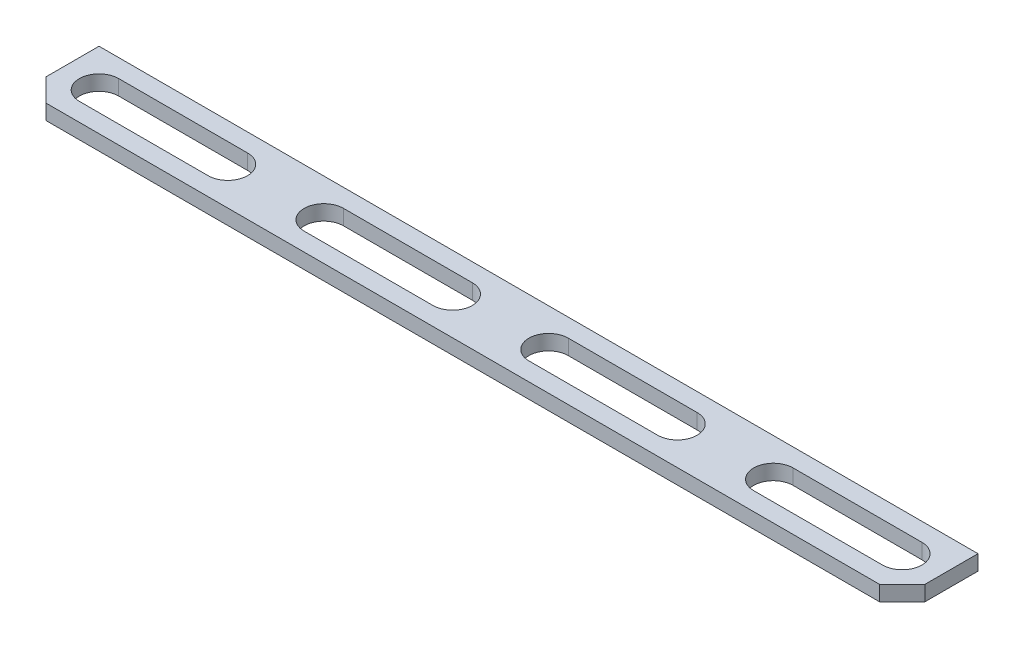
ISO-10303-21;
HEADER;
FILE_DESCRIPTION(('STEP AP214'),'2;1');
FILE_NAME('part.step','',(''),(''),'','','');
FILE_SCHEMA(('AUTOMOTIVE_DESIGN { 1 0 10303 214 1 1 1 1 }'));
ENDSEC;
DATA;
#1=APPLICATION_CONTEXT('core data for automotive mechanical design processes');
#2=APPLICATION_PROTOCOL_DEFINITION('international standard','automotive_design',2000,#1);
#3=PRODUCT_CONTEXT('',#1,'mechanical');
#4=PRODUCT('Part','Part','',(#3));
#5=PRODUCT_RELATED_PRODUCT_CATEGORY('part','',(#4));
#6=PRODUCT_DEFINITION_FORMATION('','',#4);
#7=PRODUCT_DEFINITION_CONTEXT('part definition',#1,'design');
#8=PRODUCT_DEFINITION('design','',#6,#7);
#9=PRODUCT_DEFINITION_SHAPE('','',#8);
#10=(LENGTH_UNIT() NAMED_UNIT(*) SI_UNIT(.MILLI.,.METRE.));
#11=(NAMED_UNIT(*) PLANE_ANGLE_UNIT() SI_UNIT($,.RADIAN.));
#12=(NAMED_UNIT(*) SI_UNIT($,.STERADIAN.) SOLID_ANGLE_UNIT());
#13=UNCERTAINTY_MEASURE_WITH_UNIT(LENGTH_MEASURE(1.E-05),#10,'distance_accuracy_value','');
#14=(GEOMETRIC_REPRESENTATION_CONTEXT(3) GLOBAL_UNCERTAINTY_ASSIGNED_CONTEXT((#13)) GLOBAL_UNIT_ASSIGNED_CONTEXT((#10,
#11,#12)) REPRESENTATION_CONTEXT('',''));
#15=CARTESIAN_POINT('',(0.,0.,0.));
#16=DIRECTION('',(0.,0.,1.));
#17=DIRECTION('',(1.,0.,0.));
#18=AXIS2_PLACEMENT_3D('',#15,#16,#17);
#19=CARTESIAN_POINT('',(0.,2.,0.));
#20=DIRECTION('',(1.,0.,0.));
#21=DIRECTION('',(0.,0.,-1.));
#22=AXIS2_PLACEMENT_3D('',#19,#20,#21);
#23=PLANE('',#22);
#24=DIRECTION('',(0.,0.,1.));
#25=VECTOR('',#24,1.);
#26=CARTESIAN_POINT('',(0.,0.,0.));
#27=LINE('',#26,#25);
#28=CARTESIAN_POINT('',(0.,0.,-10.));
#29=VERTEX_POINT('',#28);
#30=CARTESIAN_POINT('',(0.,0.,-3.00000000000002));
#31=VERTEX_POINT('',#30);
#32=EDGE_CURVE('E275',#29,#31,#27,.T.);
#33=ORIENTED_EDGE('',*,*,#32,.T.);
#34=DIRECTION('',(0.,1.,0.));
#35=VECTOR('',#34,1.);
#36=CARTESIAN_POINT('',(0.,2.,-3.00000000000002));
#37=LINE('',#36,#35);
#38=CARTESIAN_POINT('',(0.,2.,-3.00000000000002));
#39=VERTEX_POINT('',#38);
#40=EDGE_CURVE('E11',#31,#39,#37,.T.);
#41=ORIENTED_EDGE('',*,*,#40,.T.);
#42=DIRECTION('',(0.,0.,1.));
#43=VECTOR('',#42,1.);
#44=CARTESIAN_POINT('',(0.,2.,0.));
#45=LINE('',#44,#43);
#46=CARTESIAN_POINT('',(0.,2.,-10.));
#47=VERTEX_POINT('',#46);
#48=EDGE_CURVE('E282',#47,#39,#45,.T.);
#49=ORIENTED_EDGE('',*,*,#48,.F.);
#50=DIRECTION('',(0.,-1.,0.));
#51=VECTOR('',#50,1.);
#52=CARTESIAN_POINT('',(0.,2.,-10.));
#53=LINE('',#52,#51);
#54=EDGE_CURVE('E291',#47,#29,#53,.T.);
#55=ORIENTED_EDGE('',*,*,#54,.T.);
#56=EDGE_LOOP('',(#33,#41,#49,#55));
#57=FACE_BOUND('',#56,.T.);
#58=ADVANCED_FACE('F35',(#57),#23,.F.);
#59=CARTESIAN_POINT('',(0.,2.,0.));
#60=DIRECTION('',(0.,0.,-1.));
#61=DIRECTION('',(-1.,0.,0.));
#62=AXIS2_PLACEMENT_3D('',#59,#60,#61);
#63=PLANE('',#62);
#64=DIRECTION('',(1.,0.,0.));
#65=VECTOR('',#64,1.);
#66=CARTESIAN_POINT('',(0.,0.,0.));
#67=LINE('',#66,#65);
#68=CARTESIAN_POINT('',(3.,0.,0.));
#69=VERTEX_POINT('',#68);
#70=CARTESIAN_POINT('',(113.,0.,0.));
#71=VERTEX_POINT('',#70);
#72=EDGE_CURVE('E293',#69,#71,#67,.T.);
#73=ORIENTED_EDGE('',*,*,#72,.T.);
#74=DIRECTION('',(0.,1.,0.));
#75=VECTOR('',#74,1.);
#76=CARTESIAN_POINT('',(113.,2.,0.));
#77=LINE('',#76,#75);
#78=CARTESIAN_POINT('',(113.,2.,0.));
#79=VERTEX_POINT('',#78);
#80=EDGE_CURVE('E56',#71,#79,#77,.T.);
#81=ORIENTED_EDGE('',*,*,#80,.T.);
#82=DIRECTION('',(1.,0.,0.));
#83=VECTOR('',#82,1.);
#84=CARTESIAN_POINT('',(0.,2.,0.));
#85=LINE('',#84,#83);
#86=CARTESIAN_POINT('',(3.,2.,0.));
#87=VERTEX_POINT('',#86);
#88=EDGE_CURVE('E284',#87,#79,#85,.T.);
#89=ORIENTED_EDGE('',*,*,#88,.F.);
#90=DIRECTION('',(0.,-1.,0.));
#91=VECTOR('',#90,1.);
#92=CARTESIAN_POINT('',(3.,2.,0.));
#93=LINE('',#92,#91);
#94=EDGE_CURVE('E344',#87,#69,#93,.T.);
#95=ORIENTED_EDGE('',*,*,#94,.T.);
#96=EDGE_LOOP('',(#73,#81,#89,#95));
#97=FACE_BOUND('',#96,.T.);
#98=ADVANCED_FACE('F364',(#97),#63,.F.);
#99=CARTESIAN_POINT('',(116.,2.,0.));
#100=DIRECTION('',(-1.,0.,0.));
#101=DIRECTION('',(0.,0.,1.));
#102=AXIS2_PLACEMENT_3D('',#99,#100,#101);
#103=PLANE('',#102);
#104=DIRECTION('',(0.,0.,-1.));
#105=VECTOR('',#104,1.);
#106=CARTESIAN_POINT('',(116.,2.,0.));
#107=LINE('',#106,#105);
#108=CARTESIAN_POINT('',(116.,2.,-3.));
#109=VERTEX_POINT('',#108);
#110=CARTESIAN_POINT('',(116.,2.,-10.));
#111=VERTEX_POINT('',#110);
#112=EDGE_CURVE('E287',#109,#111,#107,.T.);
#113=ORIENTED_EDGE('',*,*,#112,.F.);
#114=DIRECTION('',(0.,-1.,0.));
#115=VECTOR('',#114,1.);
#116=CARTESIAN_POINT('',(116.,2.,-3.));
#117=LINE('',#116,#115);
#118=CARTESIAN_POINT('',(116.,0.,-3.));
#119=VERTEX_POINT('',#118);
#120=EDGE_CURVE('E337',#109,#119,#117,.T.);
#121=ORIENTED_EDGE('',*,*,#120,.T.);
#122=DIRECTION('',(0.,0.,-1.));
#123=VECTOR('',#122,1.);
#124=CARTESIAN_POINT('',(116.,0.,0.));
#125=LINE('',#124,#123);
#126=CARTESIAN_POINT('',(116.,0.,-10.));
#127=VERTEX_POINT('',#126);
#128=EDGE_CURVE('E295',#119,#127,#125,.T.);
#129=ORIENTED_EDGE('',*,*,#128,.T.);
#130=DIRECTION('',(0.,-1.,0.));
#131=VECTOR('',#130,1.);
#132=CARTESIAN_POINT('',(116.,2.,-10.));
#133=LINE('',#132,#131);
#134=EDGE_CURVE('E300',#111,#127,#133,.T.);
#135=ORIENTED_EDGE('',*,*,#134,.F.);
#136=EDGE_LOOP('',(#113,#121,#129,#135));
#137=FACE_BOUND('',#136,.T.);
#138=ADVANCED_FACE('F356',(#137),#103,.F.);
#139=CARTESIAN_POINT('',(0.,2.,-10.));
#140=DIRECTION('',(0.,0.,1.));
#141=DIRECTION('',(1.,0.,0.));
#142=AXIS2_PLACEMENT_3D('',#139,#140,#141);
#143=PLANE('',#142);
#144=DIRECTION('',(-1.,0.,0.));
#145=VECTOR('',#144,1.);
#146=CARTESIAN_POINT('',(0.,0.,-10.));
#147=LINE('',#146,#145);
#148=EDGE_CURVE('E285',#127,#29,#147,.T.);
#149=ORIENTED_EDGE('',*,*,#148,.T.);
#150=ORIENTED_EDGE('',*,*,#54,.F.);
#151=DIRECTION('',(-1.,0.,0.));
#152=VECTOR('',#151,1.);
#153=CARTESIAN_POINT('',(0.,2.,-10.));
#154=LINE('',#153,#152);
#155=EDGE_CURVE('E289',#111,#47,#154,.T.);
#156=ORIENTED_EDGE('',*,*,#155,.F.);
#157=ORIENTED_EDGE('',*,*,#134,.T.);
#158=EDGE_LOOP('',(#149,#150,#156,#157));
#159=FACE_BOUND('',#158,.T.);
#160=ADVANCED_FACE('F371',(#159),#143,.F.);
#161=CARTESIAN_POINT('',(0.,2.,0.));
#162=DIRECTION('',(0.,-1.,0.));
#163=DIRECTION('',(0.,0.,-1.));
#164=AXIS2_PLACEMENT_3D('',#161,#162,#163);
#165=PLANE('',#164);
#166=DIRECTION('',(1.,0.,0.));
#167=VECTOR('',#166,1.);
#168=CARTESIAN_POINT('',(94.,2.,-2.4));
#169=LINE('',#168,#167);
#170=CARTESIAN_POINT('',(94.,2.,-2.4));
#171=VERTEX_POINT('',#170);
#172=CARTESIAN_POINT('',(111.,2.,-2.4));
#173=VERTEX_POINT('',#172);
#174=EDGE_CURVE('E202',#171,#173,#169,.T.);
#175=ORIENTED_EDGE('',*,*,#174,.F.);
#176=CARTESIAN_POINT('',(94.,2.,-5.));
#177=DIRECTION('',(0.,1.,0.));
#178=DIRECTION('',(0.,0.,1.));
#179=AXIS2_PLACEMENT_3D('',#176,#177,#178);
#180=CIRCLE('',#179,2.6);
#181=CARTESIAN_POINT('',(94.,2.,-7.6));
#182=VERTEX_POINT('',#181);
#183=EDGE_CURVE('E207',#182,#171,#180,.T.);
#184=ORIENTED_EDGE('',*,*,#183,.F.);
#185=DIRECTION('',(-1.,0.,0.));
#186=VECTOR('',#185,1.);
#187=CARTESIAN_POINT('',(94.,2.,-7.6));
#188=LINE('',#187,#186);
#189=CARTESIAN_POINT('',(111.,2.,-7.6));
#190=VERTEX_POINT('',#189);
#191=EDGE_CURVE('E212',#190,#182,#188,.T.);
#192=ORIENTED_EDGE('',*,*,#191,.F.);
#193=CARTESIAN_POINT('',(111.,2.,-5.));
#194=DIRECTION('',(0.,1.,0.));
#195=DIRECTION('',(0.,0.,1.));
#196=AXIS2_PLACEMENT_3D('',#193,#194,#195);
#197=CIRCLE('',#196,2.6);
#198=EDGE_CURVE('E191',#173,#190,#197,.T.);
#199=ORIENTED_EDGE('',*,*,#198,.F.);
#200=EDGE_LOOP('',(#175,#184,#192,#199));
#201=FACE_BOUND('',#200,.T.);
#202=DIRECTION('',(1.,0.,0.));
#203=VECTOR('',#202,1.);
#204=CARTESIAN_POINT('',(64.3333333333333,2.,-2.4));
#205=LINE('',#204,#203);
#206=CARTESIAN_POINT('',(64.3333333333333,2.,-2.4));
#207=VERTEX_POINT('',#206);
#208=CARTESIAN_POINT('',(81.3333333333333,2.,-2.4));
#209=VERTEX_POINT('',#208);
#210=EDGE_CURVE('E223',#207,#209,#205,.T.);
#211=ORIENTED_EDGE('',*,*,#210,.F.);
#212=CARTESIAN_POINT('',(64.3333333333333,2.,-5.));
#213=DIRECTION('',(0.,1.,0.));
#214=DIRECTION('',(0.,0.,1.));
#215=AXIS2_PLACEMENT_3D('',#212,#213,#214);
#216=CIRCLE('',#215,2.6);
#217=CARTESIAN_POINT('',(64.3333333333333,2.,-7.6));
#218=VERTEX_POINT('',#217);
#219=EDGE_CURVE('E219',#218,#207,#216,.T.);
#220=ORIENTED_EDGE('',*,*,#219,.F.);
#221=DIRECTION('',(-1.,0.,0.));
#222=VECTOR('',#221,1.);
#223=CARTESIAN_POINT('',(64.3333333333333,2.,-7.6));
#224=LINE('',#223,#222);
#225=CARTESIAN_POINT('',(81.3333333333333,2.,-7.6));
#226=VERTEX_POINT('',#225);
#227=EDGE_CURVE('E229',#226,#218,#224,.T.);
#228=ORIENTED_EDGE('',*,*,#227,.F.);
#229=CARTESIAN_POINT('',(81.3333333333333,2.,-5.));
#230=DIRECTION('',(0.,1.,0.));
#231=DIRECTION('',(0.,0.,1.));
#232=AXIS2_PLACEMENT_3D('',#229,#230,#231);
#233=CIRCLE('',#232,2.6);
#234=EDGE_CURVE('E226',#209,#226,#233,.T.);
#235=ORIENTED_EDGE('',*,*,#234,.F.);
#236=EDGE_LOOP('',(#211,#220,#228,#235));
#237=FACE_BOUND('',#236,.T.);
#238=DIRECTION('',(1.,0.,0.));
#239=VECTOR('',#238,1.);
#240=CARTESIAN_POINT('',(34.6666666666667,2.,-2.4));
#241=LINE('',#240,#239);
#242=CARTESIAN_POINT('',(34.6666666666667,2.,-2.4));
#243=VERTEX_POINT('',#242);
#244=CARTESIAN_POINT('',(51.6666666666667,2.,-2.4));
#245=VERTEX_POINT('',#244);
#246=EDGE_CURVE('E243',#243,#245,#241,.T.);
#247=ORIENTED_EDGE('',*,*,#246,.F.);
#248=CARTESIAN_POINT('',(34.6666666666667,2.,-5.));
#249=DIRECTION('',(0.,1.,0.));
#250=DIRECTION('',(0.,0.,1.));
#251=AXIS2_PLACEMENT_3D('',#248,#249,#250);
#252=CIRCLE('',#251,2.6);
#253=CARTESIAN_POINT('',(34.6666666666667,2.,-7.6));
#254=VERTEX_POINT('',#253);
#255=EDGE_CURVE('E235',#254,#243,#252,.T.);
#256=ORIENTED_EDGE('',*,*,#255,.F.);
#257=DIRECTION('',(-1.,0.,0.));
#258=VECTOR('',#257,1.);
#259=CARTESIAN_POINT('',(34.6666666666667,2.,-7.6));
#260=LINE('',#259,#258);
#261=CARTESIAN_POINT('',(51.6666666666667,2.,-7.6));
#262=VERTEX_POINT('',#261);
#263=EDGE_CURVE('E249',#262,#254,#260,.T.);
#264=ORIENTED_EDGE('',*,*,#263,.F.);
#265=CARTESIAN_POINT('',(51.6666666666667,2.,-5.));
#266=DIRECTION('',(0.,1.,0.));
#267=DIRECTION('',(0.,0.,1.));
#268=AXIS2_PLACEMENT_3D('',#265,#266,#267);
#269=CIRCLE('',#268,2.6);
#270=EDGE_CURVE('E246',#245,#262,#269,.T.);
#271=ORIENTED_EDGE('',*,*,#270,.F.);
#272=EDGE_LOOP('',(#247,#256,#264,#271));
#273=FACE_BOUND('',#272,.T.);
#274=DIRECTION('',(1.,0.,0.));
#275=VECTOR('',#274,1.);
#276=CARTESIAN_POINT('',(5.,2.,-2.4));
#277=LINE('',#276,#275);
#278=CARTESIAN_POINT('',(5.,2.,-2.4));
#279=VERTEX_POINT('',#278);
#280=CARTESIAN_POINT('',(22.,2.,-2.4));
#281=VERTEX_POINT('',#280);
#282=EDGE_CURVE('E263',#279,#281,#277,.T.);
#283=ORIENTED_EDGE('',*,*,#282,.F.);
#284=CARTESIAN_POINT('',(5.,2.,-5.));
#285=DIRECTION('',(0.,1.,0.));
#286=DIRECTION('',(0.,0.,1.));
#287=AXIS2_PLACEMENT_3D('',#284,#285,#286);
#288=CIRCLE('',#287,2.6);
#289=CARTESIAN_POINT('',(5.,2.,-7.6));
#290=VERTEX_POINT('',#289);
#291=EDGE_CURVE('E255',#290,#279,#288,.T.);
#292=ORIENTED_EDGE('',*,*,#291,.F.);
#293=DIRECTION('',(-1.,0.,0.));
#294=VECTOR('',#293,1.);
#295=CARTESIAN_POINT('',(5.,2.,-7.6));
#296=LINE('',#295,#294);
#297=CARTESIAN_POINT('',(22.,2.,-7.6));
#298=VERTEX_POINT('',#297);
#299=EDGE_CURVE('E269',#298,#290,#296,.T.);
#300=ORIENTED_EDGE('',*,*,#299,.F.);
#301=CARTESIAN_POINT('',(22.,2.,-5.));
#302=DIRECTION('',(0.,1.,0.));
#303=DIRECTION('',(0.,0.,1.));
#304=AXIS2_PLACEMENT_3D('',#301,#302,#303);
#305=CIRCLE('',#304,2.6);
#306=EDGE_CURVE('E266',#281,#298,#305,.T.);
#307=ORIENTED_EDGE('',*,*,#306,.F.);
#308=EDGE_LOOP('',(#283,#292,#300,#307));
#309=FACE_BOUND('',#308,.T.);
#310=ORIENTED_EDGE('',*,*,#88,.T.);
#311=DIRECTION('',(-0.707106781186549,0.,0.707106781186546));
#312=VECTOR('',#311,1.);
#313=CARTESIAN_POINT('',(116.,2.,-3.));
#314=LINE('',#313,#312);
#315=EDGE_CURVE('E43',#79,#109,#314,.F.);
#316=ORIENTED_EDGE('',*,*,#315,.T.);
#317=ORIENTED_EDGE('',*,*,#112,.T.);
#318=ORIENTED_EDGE('',*,*,#155,.T.);
#319=ORIENTED_EDGE('',*,*,#48,.T.);
#320=DIRECTION('',(-0.707106781186546,0.,-0.707106781186549));
#321=VECTOR('',#320,1.);
#322=CARTESIAN_POINT('',(3.,2.,0.));
#323=LINE('',#322,#321);
#324=EDGE_CURVE('E348',#39,#87,#323,.F.);
#325=ORIENTED_EDGE('',*,*,#324,.T.);
#326=EDGE_LOOP('',(#310,#316,#317,#318,#319,#325));
#327=FACE_BOUND('',#326,.T.);
#328=ADVANCED_FACE('F209',(#201,#237,#273,#309,#327),#165,.F.);
#329=CARTESIAN_POINT('',(0.,0.,0.));
#330=DIRECTION('',(0.,-1.,0.));
#331=DIRECTION('',(0.,0.,-1.));
#332=AXIS2_PLACEMENT_3D('',#329,#330,#331);
#333=PLANE('',#332);
#334=CARTESIAN_POINT('',(94.,0.,-5.));
#335=DIRECTION('',(0.,-1.,0.));
#336=DIRECTION('',(0.,0.,-1.));
#337=AXIS2_PLACEMENT_3D('',#334,#335,#336);
#338=CIRCLE('',#337,2.6);
#339=CARTESIAN_POINT('',(94.,0.,-2.4));
#340=VERTEX_POINT('',#339);
#341=CARTESIAN_POINT('',(94.,0.,-7.6));
#342=VERTEX_POINT('',#341);
#343=EDGE_CURVE('E335',#340,#342,#338,.T.);
#344=ORIENTED_EDGE('',*,*,#343,.F.);
#345=DIRECTION('',(-1.,0.,0.));
#346=VECTOR('',#345,1.);
#347=CARTESIAN_POINT('',(0.,0.,-2.4));
#348=LINE('',#347,#346);
#349=CARTESIAN_POINT('',(111.,0.,-2.4));
#350=VERTEX_POINT('',#349);
#351=EDGE_CURVE('E330',#350,#340,#348,.T.);
#352=ORIENTED_EDGE('',*,*,#351,.F.);
#353=CARTESIAN_POINT('',(111.,0.,-5.));
#354=DIRECTION('',(0.,-1.,0.));
#355=DIRECTION('',(0.,0.,-1.));
#356=AXIS2_PLACEMENT_3D('',#353,#354,#355);
#357=CIRCLE('',#356,2.6);
#358=CARTESIAN_POINT('',(111.,0.,-7.6));
#359=VERTEX_POINT('',#358);
#360=EDGE_CURVE('E194',#359,#350,#357,.T.);
#361=ORIENTED_EDGE('',*,*,#360,.F.);
#362=DIRECTION('',(1.,0.,0.));
#363=VECTOR('',#362,1.);
#364=CARTESIAN_POINT('',(0.,0.,-7.6));
#365=LINE('',#364,#363);
#366=EDGE_CURVE('E333',#342,#359,#365,.T.);
#367=ORIENTED_EDGE('',*,*,#366,.F.);
#368=EDGE_LOOP('',(#344,#352,#361,#367));
#369=FACE_BOUND('',#368,.T.);
#370=CARTESIAN_POINT('',(64.3333333333333,0.,-5.));
#371=DIRECTION('',(0.,-1.,0.));
#372=DIRECTION('',(0.,0.,-1.));
#373=AXIS2_PLACEMENT_3D('',#370,#371,#372);
#374=CIRCLE('',#373,2.6);
#375=CARTESIAN_POINT('',(64.3333333333333,0.,-2.4));
#376=VERTEX_POINT('',#375);
#377=CARTESIAN_POINT('',(64.3333333333333,0.,-7.6));
#378=VERTEX_POINT('',#377);
#379=EDGE_CURVE('E328',#376,#378,#374,.T.);
#380=ORIENTED_EDGE('',*,*,#379,.F.);
#381=DIRECTION('',(-1.,0.,0.));
#382=VECTOR('',#381,1.);
#383=CARTESIAN_POINT('',(0.,0.,-2.4));
#384=LINE('',#383,#382);
#385=CARTESIAN_POINT('',(81.3333333333333,0.,-2.4));
#386=VERTEX_POINT('',#385);
#387=EDGE_CURVE('E321',#386,#376,#384,.T.);
#388=ORIENTED_EDGE('',*,*,#387,.F.);
#389=CARTESIAN_POINT('',(81.3333333333333,0.,-5.));
#390=DIRECTION('',(0.,-1.,0.));
#391=DIRECTION('',(0.,0.,-1.));
#392=AXIS2_PLACEMENT_3D('',#389,#390,#391);
#393=CIRCLE('',#392,2.6);
#394=CARTESIAN_POINT('',(81.3333333333333,0.,-7.6));
#395=VERTEX_POINT('',#394);
#396=EDGE_CURVE('E323',#395,#386,#393,.T.);
#397=ORIENTED_EDGE('',*,*,#396,.F.);
#398=DIRECTION('',(1.,0.,0.));
#399=VECTOR('',#398,1.);
#400=CARTESIAN_POINT('',(0.,0.,-7.6));
#401=LINE('',#400,#399);
#402=EDGE_CURVE('E326',#378,#395,#401,.T.);
#403=ORIENTED_EDGE('',*,*,#402,.F.);
#404=EDGE_LOOP('',(#380,#388,#397,#403));
#405=FACE_BOUND('',#404,.T.);
#406=CARTESIAN_POINT('',(34.6666666666667,0.,-5.));
#407=DIRECTION('',(0.,-1.,0.));
#408=DIRECTION('',(0.,0.,-1.));
#409=AXIS2_PLACEMENT_3D('',#406,#407,#408);
#410=CIRCLE('',#409,2.6);
#411=CARTESIAN_POINT('',(34.6666666666667,0.,-2.4));
#412=VERTEX_POINT('',#411);
#413=CARTESIAN_POINT('',(34.6666666666667,0.,-7.6));
#414=VERTEX_POINT('',#413);
#415=EDGE_CURVE('E319',#412,#414,#410,.T.);
#416=ORIENTED_EDGE('',*,*,#415,.F.);
#417=DIRECTION('',(-1.,0.,0.));
#418=VECTOR('',#417,1.);
#419=CARTESIAN_POINT('',(0.,0.,-2.4));
#420=LINE('',#419,#418);
#421=CARTESIAN_POINT('',(51.6666666666667,0.,-2.4));
#422=VERTEX_POINT('',#421);
#423=EDGE_CURVE('E312',#422,#412,#420,.T.);
#424=ORIENTED_EDGE('',*,*,#423,.F.);
#425=CARTESIAN_POINT('',(51.6666666666667,0.,-5.));
#426=DIRECTION('',(0.,-1.,0.));
#427=DIRECTION('',(0.,0.,-1.));
#428=AXIS2_PLACEMENT_3D('',#425,#426,#427);
#429=CIRCLE('',#428,2.6);
#430=CARTESIAN_POINT('',(51.6666666666667,0.,-7.6));
#431=VERTEX_POINT('',#430);
#432=EDGE_CURVE('E314',#431,#422,#429,.T.);
#433=ORIENTED_EDGE('',*,*,#432,.F.);
#434=DIRECTION('',(1.,0.,0.));
#435=VECTOR('',#434,1.);
#436=CARTESIAN_POINT('',(0.,0.,-7.6));
#437=LINE('',#436,#435);
#438=EDGE_CURVE('E317',#414,#431,#437,.T.);
#439=ORIENTED_EDGE('',*,*,#438,.F.);
#440=EDGE_LOOP('',(#416,#424,#433,#439));
#441=FACE_BOUND('',#440,.T.);
#442=CARTESIAN_POINT('',(5.,0.,-5.));
#443=DIRECTION('',(0.,-1.,0.));
#444=DIRECTION('',(0.,0.,-1.));
#445=AXIS2_PLACEMENT_3D('',#442,#443,#444);
#446=CIRCLE('',#445,2.6);
#447=CARTESIAN_POINT('',(5.,0.,-2.4));
#448=VERTEX_POINT('',#447);
#449=CARTESIAN_POINT('',(5.,0.,-7.6));
#450=VERTEX_POINT('',#449);
#451=EDGE_CURVE('E310',#448,#450,#446,.T.);
#452=ORIENTED_EDGE('',*,*,#451,.F.);
#453=DIRECTION('',(-1.,0.,0.));
#454=VECTOR('',#453,1.);
#455=CARTESIAN_POINT('',(0.,0.,-2.4));
#456=LINE('',#455,#454);
#457=CARTESIAN_POINT('',(22.,0.,-2.4));
#458=VERTEX_POINT('',#457);
#459=EDGE_CURVE('E303',#458,#448,#456,.T.);
#460=ORIENTED_EDGE('',*,*,#459,.F.);
#461=CARTESIAN_POINT('',(22.,0.,-5.));
#462=DIRECTION('',(0.,-1.,0.));
#463=DIRECTION('',(0.,0.,-1.));
#464=AXIS2_PLACEMENT_3D('',#461,#462,#463);
#465=CIRCLE('',#464,2.6);
#466=CARTESIAN_POINT('',(22.,0.,-7.6));
#467=VERTEX_POINT('',#466);
#468=EDGE_CURVE('E305',#467,#458,#465,.T.);
#469=ORIENTED_EDGE('',*,*,#468,.F.);
#470=DIRECTION('',(1.,0.,0.));
#471=VECTOR('',#470,1.);
#472=CARTESIAN_POINT('',(0.,0.,-7.6));
#473=LINE('',#472,#471);
#474=EDGE_CURVE('E308',#450,#467,#473,.T.);
#475=ORIENTED_EDGE('',*,*,#474,.F.);
#476=EDGE_LOOP('',(#452,#460,#469,#475));
#477=FACE_BOUND('',#476,.T.);
#478=ORIENTED_EDGE('',*,*,#128,.F.);
#479=DIRECTION('',(0.707106781186549,0.,-0.707106781186546));
#480=VECTOR('',#479,1.);
#481=CARTESIAN_POINT('',(56.4999999999997,0.,56.5));
#482=LINE('',#481,#480);
#483=EDGE_CURVE('E342',#119,#71,#482,.F.);
#484=ORIENTED_EDGE('',*,*,#483,.T.);
#485=ORIENTED_EDGE('',*,*,#72,.F.);
#486=DIRECTION('',(0.707106781186546,0.,0.707106781186549));
#487=VECTOR('',#486,1.);
#488=CARTESIAN_POINT('',(1.50000000000001,0.,-1.5));
#489=LINE('',#488,#487);
#490=EDGE_CURVE('E340',#69,#31,#489,.F.);
#491=ORIENTED_EDGE('',*,*,#490,.T.);
#492=ORIENTED_EDGE('',*,*,#32,.F.);
#493=ORIENTED_EDGE('',*,*,#148,.F.);
#494=EDGE_LOOP('',(#478,#484,#485,#491,#492,#493));
#495=FACE_BOUND('',#494,.T.);
#496=ADVANCED_FACE('F362',(#369,#405,#441,#477,#495),#333,.T.);
#497=CARTESIAN_POINT('',(5.,-8.,-5.));
#498=DIRECTION('',(0.,1.,0.));
#499=DIRECTION('',(0.,0.,1.));
#500=AXIS2_PLACEMENT_3D('',#497,#498,#499);
#501=CYLINDRICAL_SURFACE('',#500,2.6);
#502=ORIENTED_EDGE('',*,*,#451,.T.);
#503=DIRECTION('',(0.,1.,0.));
#504=VECTOR('',#503,1.);
#505=CARTESIAN_POINT('',(5.,-8.,-7.6));
#506=LINE('',#505,#504);
#507=EDGE_CURVE('E273',#450,#290,#506,.T.);
#508=ORIENTED_EDGE('',*,*,#507,.T.);
#509=ORIENTED_EDGE('',*,*,#291,.T.);
#510=DIRECTION('',(0.,1.,0.));
#511=VECTOR('',#510,1.);
#512=CARTESIAN_POINT('',(5.,-8.,-2.4));
#513=LINE('',#512,#511);
#514=EDGE_CURVE('E272',#448,#279,#513,.T.);
#515=ORIENTED_EDGE('',*,*,#514,.F.);
#516=EDGE_LOOP('',(#502,#508,#509,#515));
#517=FACE_BOUND('',#516,.T.);
#518=ADVANCED_FACE('F441',(#517),#501,.F.);
#519=CARTESIAN_POINT('',(5.,-8.,-7.6));
#520=DIRECTION('',(0.,0.,-1.));
#521=DIRECTION('',(-1.,0.,0.));
#522=AXIS2_PLACEMENT_3D('',#519,#520,#521);
#523=PLANE('',#522);
#524=ORIENTED_EDGE('',*,*,#474,.T.);
#525=DIRECTION('',(0.,1.,0.));
#526=VECTOR('',#525,1.);
#527=CARTESIAN_POINT('',(22.,-8.,-7.6));
#528=LINE('',#527,#526);
#529=EDGE_CURVE('E276',#467,#298,#528,.T.);
#530=ORIENTED_EDGE('',*,*,#529,.T.);
#531=ORIENTED_EDGE('',*,*,#299,.T.);
#532=ORIENTED_EDGE('',*,*,#507,.F.);
#533=EDGE_LOOP('',(#524,#530,#531,#532));
#534=FACE_BOUND('',#533,.T.);
#535=ADVANCED_FACE('F437',(#534),#523,.F.);
#536=CARTESIAN_POINT('',(22.,-8.,-5.));
#537=DIRECTION('',(0.,1.,0.));
#538=DIRECTION('',(0.,0.,1.));
#539=AXIS2_PLACEMENT_3D('',#536,#537,#538);
#540=CYLINDRICAL_SURFACE('',#539,2.6);
#541=ORIENTED_EDGE('',*,*,#468,.T.);
#542=DIRECTION('',(0.,1.,0.));
#543=VECTOR('',#542,1.);
#544=CARTESIAN_POINT('',(22.,-8.,-2.4));
#545=LINE('',#544,#543);
#546=EDGE_CURVE('E278',#458,#281,#545,.T.);
#547=ORIENTED_EDGE('',*,*,#546,.T.);
#548=ORIENTED_EDGE('',*,*,#306,.T.);
#549=ORIENTED_EDGE('',*,*,#529,.F.);
#550=EDGE_LOOP('',(#541,#547,#548,#549));
#551=FACE_BOUND('',#550,.T.);
#552=ADVANCED_FACE('F440',(#551),#540,.F.);
#553=CARTESIAN_POINT('',(5.,-8.,-2.4));
#554=DIRECTION('',(0.,0.,1.));
#555=DIRECTION('',(1.,0.,0.));
#556=AXIS2_PLACEMENT_3D('',#553,#554,#555);
#557=PLANE('',#556);
#558=ORIENTED_EDGE('',*,*,#459,.T.);
#559=ORIENTED_EDGE('',*,*,#514,.T.);
#560=ORIENTED_EDGE('',*,*,#282,.T.);
#561=ORIENTED_EDGE('',*,*,#546,.F.);
#562=EDGE_LOOP('',(#558,#559,#560,#561));
#563=FACE_BOUND('',#562,.T.);
#564=ADVANCED_FACE('F435',(#563),#557,.F.);
#565=CARTESIAN_POINT('',(34.6666666666667,-8.,-5.));
#566=DIRECTION('',(0.,1.,0.));
#567=DIRECTION('',(0.,0.,1.));
#568=AXIS2_PLACEMENT_3D('',#565,#566,#567);
#569=CYLINDRICAL_SURFACE('',#568,2.6);
#570=ORIENTED_EDGE('',*,*,#415,.T.);
#571=DIRECTION('',(0.,1.,0.));
#572=VECTOR('',#571,1.);
#573=CARTESIAN_POINT('',(34.6666666666667,-8.,-7.6));
#574=LINE('',#573,#572);
#575=EDGE_CURVE('E253',#414,#254,#574,.T.);
#576=ORIENTED_EDGE('',*,*,#575,.T.);
#577=ORIENTED_EDGE('',*,*,#255,.T.);
#578=DIRECTION('',(0.,1.,0.));
#579=VECTOR('',#578,1.);
#580=CARTESIAN_POINT('',(34.6666666666667,-8.,-2.4));
#581=LINE('',#580,#579);
#582=EDGE_CURVE('E252',#412,#243,#581,.T.);
#583=ORIENTED_EDGE('',*,*,#582,.F.);
#584=EDGE_LOOP('',(#570,#576,#577,#583));
#585=FACE_BOUND('',#584,.T.);
#586=ADVANCED_FACE('F425',(#585),#569,.F.);
#587=CARTESIAN_POINT('',(34.6666666666667,-8.,-7.6));
#588=DIRECTION('',(0.,0.,-1.));
#589=DIRECTION('',(-1.,0.,0.));
#590=AXIS2_PLACEMENT_3D('',#587,#588,#589);
#591=PLANE('',#590);
#592=ORIENTED_EDGE('',*,*,#438,.T.);
#593=DIRECTION('',(0.,1.,0.));
#594=VECTOR('',#593,1.);
#595=CARTESIAN_POINT('',(51.6666666666667,-8.,-7.6));
#596=LINE('',#595,#594);
#597=EDGE_CURVE('E256',#431,#262,#596,.T.);
#598=ORIENTED_EDGE('',*,*,#597,.T.);
#599=ORIENTED_EDGE('',*,*,#263,.T.);
#600=ORIENTED_EDGE('',*,*,#575,.F.);
#601=EDGE_LOOP('',(#592,#598,#599,#600));
#602=FACE_BOUND('',#601,.T.);
#603=ADVANCED_FACE('F421',(#602),#591,.F.);
#604=CARTESIAN_POINT('',(51.6666666666667,-8.,-5.));
#605=DIRECTION('',(0.,1.,0.));
#606=DIRECTION('',(0.,0.,1.));
#607=AXIS2_PLACEMENT_3D('',#604,#605,#606);
#608=CYLINDRICAL_SURFACE('',#607,2.6);
#609=ORIENTED_EDGE('',*,*,#432,.T.);
#610=DIRECTION('',(0.,1.,0.));
#611=VECTOR('',#610,1.);
#612=CARTESIAN_POINT('',(51.6666666666667,-8.,-2.4));
#613=LINE('',#612,#611);
#614=EDGE_CURVE('E258',#422,#245,#613,.T.);
#615=ORIENTED_EDGE('',*,*,#614,.T.);
#616=ORIENTED_EDGE('',*,*,#270,.T.);
#617=ORIENTED_EDGE('',*,*,#597,.F.);
#618=EDGE_LOOP('',(#609,#615,#616,#617));
#619=FACE_BOUND('',#618,.T.);
#620=ADVANCED_FACE('F424',(#619),#608,.F.);
#621=CARTESIAN_POINT('',(34.6666666666667,-8.,-2.4));
#622=DIRECTION('',(0.,0.,1.));
#623=DIRECTION('',(1.,0.,0.));
#624=AXIS2_PLACEMENT_3D('',#621,#622,#623);
#625=PLANE('',#624);
#626=ORIENTED_EDGE('',*,*,#423,.T.);
#627=ORIENTED_EDGE('',*,*,#582,.T.);
#628=ORIENTED_EDGE('',*,*,#246,.T.);
#629=ORIENTED_EDGE('',*,*,#614,.F.);
#630=EDGE_LOOP('',(#626,#627,#628,#629));
#631=FACE_BOUND('',#630,.T.);
#632=ADVANCED_FACE('F419',(#631),#625,.F.);
#633=CARTESIAN_POINT('',(64.3333333333333,-8.,-5.));
#634=DIRECTION('',(0.,1.,0.));
#635=DIRECTION('',(0.,0.,1.));
#636=AXIS2_PLACEMENT_3D('',#633,#634,#635);
#637=CYLINDRICAL_SURFACE('',#636,2.6);
#638=ORIENTED_EDGE('',*,*,#379,.T.);
#639=DIRECTION('',(0.,1.,0.));
#640=VECTOR('',#639,1.);
#641=CARTESIAN_POINT('',(64.3333333333333,-8.,-7.6));
#642=LINE('',#641,#640);
#643=EDGE_CURVE('E233',#378,#218,#642,.T.);
#644=ORIENTED_EDGE('',*,*,#643,.T.);
#645=ORIENTED_EDGE('',*,*,#219,.T.);
#646=DIRECTION('',(0.,1.,0.));
#647=VECTOR('',#646,1.);
#648=CARTESIAN_POINT('',(64.3333333333333,-8.,-2.4));
#649=LINE('',#648,#647);
#650=EDGE_CURVE('E232',#376,#207,#649,.T.);
#651=ORIENTED_EDGE('',*,*,#650,.F.);
#652=EDGE_LOOP('',(#638,#644,#645,#651));
#653=FACE_BOUND('',#652,.T.);
#654=ADVANCED_FACE('F409',(#653),#637,.F.);
#655=CARTESIAN_POINT('',(64.3333333333333,-8.,-7.6));
#656=DIRECTION('',(0.,0.,-1.));
#657=DIRECTION('',(-1.,0.,0.));
#658=AXIS2_PLACEMENT_3D('',#655,#656,#657);
#659=PLANE('',#658);
#660=ORIENTED_EDGE('',*,*,#402,.T.);
#661=DIRECTION('',(0.,1.,0.));
#662=VECTOR('',#661,1.);
#663=CARTESIAN_POINT('',(81.3333333333333,-8.,-7.6));
#664=LINE('',#663,#662);
#665=EDGE_CURVE('E236',#395,#226,#664,.T.);
#666=ORIENTED_EDGE('',*,*,#665,.T.);
#667=ORIENTED_EDGE('',*,*,#227,.T.);
#668=ORIENTED_EDGE('',*,*,#643,.F.);
#669=EDGE_LOOP('',(#660,#666,#667,#668));
#670=FACE_BOUND('',#669,.T.);
#671=ADVANCED_FACE('F405',(#670),#659,.F.);
#672=CARTESIAN_POINT('',(81.3333333333333,-8.,-5.));
#673=DIRECTION('',(0.,1.,0.));
#674=DIRECTION('',(0.,0.,1.));
#675=AXIS2_PLACEMENT_3D('',#672,#673,#674);
#676=CYLINDRICAL_SURFACE('',#675,2.6);
#677=ORIENTED_EDGE('',*,*,#396,.T.);
#678=DIRECTION('',(0.,1.,0.));
#679=VECTOR('',#678,1.);
#680=CARTESIAN_POINT('',(81.3333333333333,-8.,-2.4));
#681=LINE('',#680,#679);
#682=EDGE_CURVE('E238',#386,#209,#681,.T.);
#683=ORIENTED_EDGE('',*,*,#682,.T.);
#684=ORIENTED_EDGE('',*,*,#234,.T.);
#685=ORIENTED_EDGE('',*,*,#665,.F.);
#686=EDGE_LOOP('',(#677,#683,#684,#685));
#687=FACE_BOUND('',#686,.T.);
#688=ADVANCED_FACE('F408',(#687),#676,.F.);
#689=CARTESIAN_POINT('',(64.3333333333333,-8.,-2.4));
#690=DIRECTION('',(0.,0.,1.));
#691=DIRECTION('',(1.,0.,0.));
#692=AXIS2_PLACEMENT_3D('',#689,#690,#691);
#693=PLANE('',#692);
#694=ORIENTED_EDGE('',*,*,#387,.T.);
#695=ORIENTED_EDGE('',*,*,#650,.T.);
#696=ORIENTED_EDGE('',*,*,#210,.T.);
#697=ORIENTED_EDGE('',*,*,#682,.F.);
#698=EDGE_LOOP('',(#694,#695,#696,#697));
#699=FACE_BOUND('',#698,.T.);
#700=ADVANCED_FACE('F403',(#699),#693,.F.);
#701=CARTESIAN_POINT('',(94.,-8.,-5.));
#702=DIRECTION('',(0.,1.,0.));
#703=DIRECTION('',(0.,0.,1.));
#704=AXIS2_PLACEMENT_3D('',#701,#702,#703);
#705=CYLINDRICAL_SURFACE('',#704,2.6);
#706=ORIENTED_EDGE('',*,*,#343,.T.);
#707=DIRECTION('',(0.,1.,0.));
#708=VECTOR('',#707,1.);
#709=CARTESIAN_POINT('',(94.,-8.,-7.6));
#710=LINE('',#709,#708);
#711=EDGE_CURVE('E217',#342,#182,#710,.T.);
#712=ORIENTED_EDGE('',*,*,#711,.T.);
#713=ORIENTED_EDGE('',*,*,#183,.T.);
#714=DIRECTION('',(0.,1.,0.));
#715=VECTOR('',#714,1.);
#716=CARTESIAN_POINT('',(94.,-8.,-2.4));
#717=LINE('',#716,#715);
#718=EDGE_CURVE('E198',#340,#171,#717,.T.);
#719=ORIENTED_EDGE('',*,*,#718,.F.);
#720=EDGE_LOOP('',(#706,#712,#713,#719));
#721=FACE_BOUND('',#720,.T.);
#722=ADVANCED_FACE('F400',(#721),#705,.F.);
#723=CARTESIAN_POINT('',(94.,-8.,-7.6));
#724=DIRECTION('',(0.,0.,-1.));
#725=DIRECTION('',(-1.,0.,0.));
#726=AXIS2_PLACEMENT_3D('',#723,#724,#725);
#727=PLANE('',#726);
#728=ORIENTED_EDGE('',*,*,#366,.T.);
#729=DIRECTION('',(0.,1.,0.));
#730=VECTOR('',#729,1.);
#731=CARTESIAN_POINT('',(111.,-8.,-7.6));
#732=LINE('',#731,#730);
#733=EDGE_CURVE('E197',#359,#190,#732,.T.);
#734=ORIENTED_EDGE('',*,*,#733,.T.);
#735=ORIENTED_EDGE('',*,*,#191,.T.);
#736=ORIENTED_EDGE('',*,*,#711,.F.);
#737=EDGE_LOOP('',(#728,#734,#735,#736));
#738=FACE_BOUND('',#737,.T.);
#739=ADVANCED_FACE('F396',(#738),#727,.F.);
#740=CARTESIAN_POINT('',(111.,-8.,-5.));
#741=DIRECTION('',(0.,1.,0.));
#742=DIRECTION('',(0.,0.,1.));
#743=AXIS2_PLACEMENT_3D('',#740,#741,#742);
#744=CYLINDRICAL_SURFACE('',#743,2.6);
#745=ORIENTED_EDGE('',*,*,#360,.T.);
#746=DIRECTION('',(0.,1.,0.));
#747=VECTOR('',#746,1.);
#748=CARTESIAN_POINT('',(111.,-8.,-2.4));
#749=LINE('',#748,#747);
#750=EDGE_CURVE('E186',#350,#173,#749,.T.);
#751=ORIENTED_EDGE('',*,*,#750,.T.);
#752=ORIENTED_EDGE('',*,*,#198,.T.);
#753=ORIENTED_EDGE('',*,*,#733,.F.);
#754=EDGE_LOOP('',(#745,#751,#752,#753));
#755=FACE_BOUND('',#754,.T.);
#756=ADVANCED_FACE('F188',(#755),#744,.F.);
#757=CARTESIAN_POINT('',(94.,-8.,-2.4));
#758=DIRECTION('',(0.,0.,1.));
#759=DIRECTION('',(1.,0.,0.));
#760=AXIS2_PLACEMENT_3D('',#757,#758,#759);
#761=PLANE('',#760);
#762=ORIENTED_EDGE('',*,*,#351,.T.);
#763=ORIENTED_EDGE('',*,*,#718,.T.);
#764=ORIENTED_EDGE('',*,*,#174,.T.);
#765=ORIENTED_EDGE('',*,*,#750,.F.);
#766=EDGE_LOOP('',(#762,#763,#764,#765));
#767=FACE_BOUND('',#766,.T.);
#768=ADVANCED_FACE('F203',(#767),#761,.F.);
#769=CARTESIAN_POINT('',(116.,2.,-3.));
#770=DIRECTION('',(-0.707106781186546,0.,-0.707106781186549));
#771=DIRECTION('',(0.,-1.,0.));
#772=AXIS2_PLACEMENT_3D('',#769,#770,#771);
#773=PLANE('',#772);
#774=ORIENTED_EDGE('',*,*,#315,.F.);
#775=ORIENTED_EDGE('',*,*,#80,.F.);
#776=ORIENTED_EDGE('',*,*,#483,.F.);
#777=ORIENTED_EDGE('',*,*,#120,.F.);
#778=EDGE_LOOP('',(#774,#775,#776,#777));
#779=FACE_BOUND('',#778,.T.);
#780=ADVANCED_FACE('F359',(#779),#773,.F.);
#781=CARTESIAN_POINT('',(3.,2.,0.));
#782=DIRECTION('',(0.707106781186549,0.,-0.707106781186546));
#783=DIRECTION('',(0.,-1.,0.));
#784=AXIS2_PLACEMENT_3D('',#781,#782,#783);
#785=PLANE('',#784);
#786=ORIENTED_EDGE('',*,*,#324,.F.);
#787=ORIENTED_EDGE('',*,*,#40,.F.);
#788=ORIENTED_EDGE('',*,*,#490,.F.);
#789=ORIENTED_EDGE('',*,*,#94,.F.);
#790=EDGE_LOOP('',(#786,#787,#788,#789));
#791=FACE_BOUND('',#790,.T.);
#792=ADVANCED_FACE('F37',(#791),#785,.F.);
#793=CLOSED_SHELL('',(#58,#98,#138,#160,#328,#496,#518,#535,#552,#564,#586,#603,#620,#632,#654,
#671,#688,#700,#722,#739,#756,#768,#780,#792));
#794=MANIFOLD_SOLID_BREP('B2',#793);
#795=ADVANCED_BREP_SHAPE_REPRESENTATION('',(#18,#794),#14);
#796=SHAPE_DEFINITION_REPRESENTATION(#9,#795);
ENDSEC;
END-ISO-10303-21;
